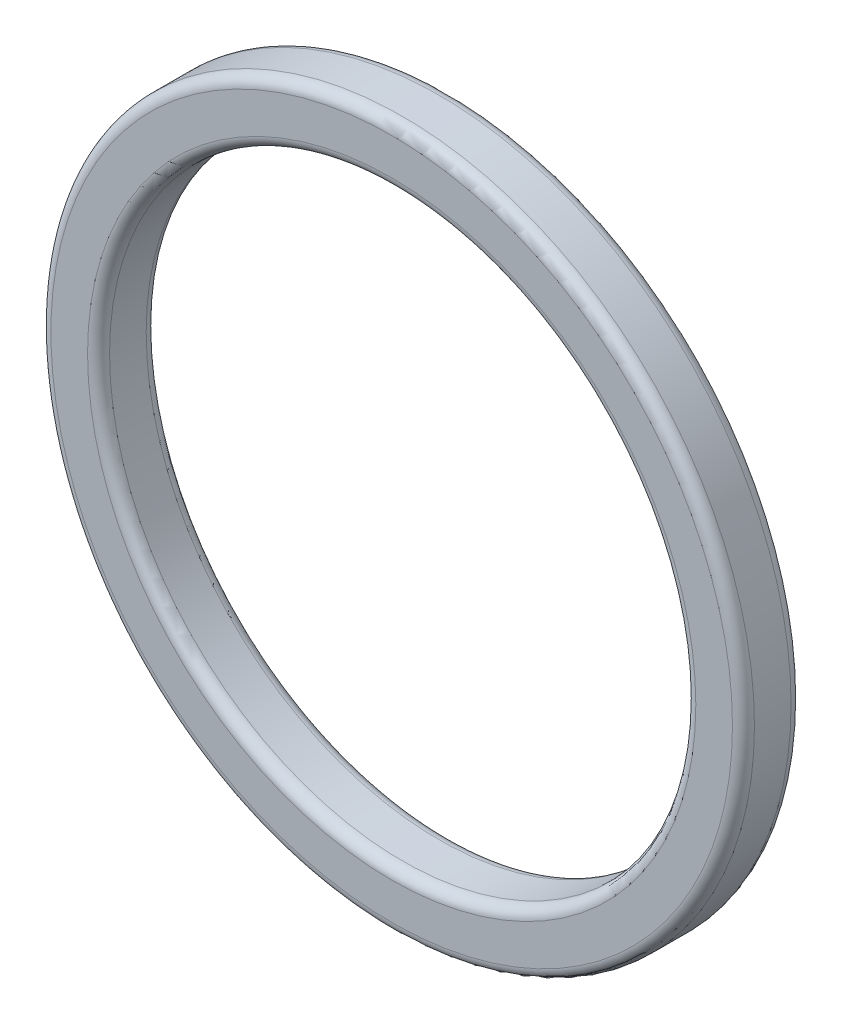
ISO-10303-21;
HEADER;
FILE_DESCRIPTION(('STEP AP214'),'2;1');
FILE_NAME('part.step','',(''),(''),'','','');
FILE_SCHEMA(('AUTOMOTIVE_DESIGN { 1 0 10303 214 1 1 1 1 }'));
ENDSEC;
DATA;
#1=APPLICATION_CONTEXT('core data for automotive mechanical design processes');
#2=APPLICATION_PROTOCOL_DEFINITION('international standard','automotive_design',2000,#1);
#3=PRODUCT_CONTEXT('',#1,'mechanical');
#4=PRODUCT('Part','Part','',(#3));
#5=PRODUCT_RELATED_PRODUCT_CATEGORY('part','',(#4));
#6=PRODUCT_DEFINITION_FORMATION('','',#4);
#7=PRODUCT_DEFINITION_CONTEXT('part definition',#1,'design');
#8=PRODUCT_DEFINITION('design','',#6,#7);
#9=PRODUCT_DEFINITION_SHAPE('','',#8);
#10=(LENGTH_UNIT() NAMED_UNIT(*) SI_UNIT(.MILLI.,.METRE.));
#11=(NAMED_UNIT(*) PLANE_ANGLE_UNIT() SI_UNIT($,.RADIAN.));
#12=(NAMED_UNIT(*) SI_UNIT($,.STERADIAN.) SOLID_ANGLE_UNIT());
#13=UNCERTAINTY_MEASURE_WITH_UNIT(LENGTH_MEASURE(1.E-05),#10,'distance_accuracy_value','');
#14=(GEOMETRIC_REPRESENTATION_CONTEXT(3) GLOBAL_UNCERTAINTY_ASSIGNED_CONTEXT((#13)) GLOBAL_UNIT_ASSIGNED_CONTEXT((#10,
#11,#12)) REPRESENTATION_CONTEXT('',''));
#15=CARTESIAN_POINT('',(0.,0.,0.));
#16=DIRECTION('',(0.,0.,1.));
#17=DIRECTION('',(1.,0.,0.));
#18=AXIS2_PLACEMENT_3D('',#15,#16,#17);
#19=CARTESIAN_POINT('',(0.,0.,8.));
#20=DIRECTION('',(0.,0.,-1.));
#21=DIRECTION('',(-1.,0.,0.));
#22=AXIS2_PLACEMENT_3D('',#19,#20,#21);
#23=CYLINDRICAL_SURFACE('',#22,48.);
#24=CARTESIAN_POINT('',(0.,0.,1.5));
#25=DIRECTION('',(0.,0.,1.));
#26=DIRECTION('',(1.,0.,0.));
#27=AXIS2_PLACEMENT_3D('',#24,#25,#26);
#28=CIRCLE('',#27,48.);
#29=CARTESIAN_POINT('',(48.,0.,1.5));
#30=VERTEX_POINT('',#29);
#31=EDGE_CURVE('E10',#30,#30,#28,.T.);
#32=ORIENTED_EDGE('',*,*,#31,.T.);
#33=EDGE_LOOP('',(#32));
#34=FACE_BOUND('',#33,.T.);
#35=CARTESIAN_POINT('',(0.,0.,6.5));
#36=DIRECTION('',(0.,0.,1.));
#37=DIRECTION('',(1.,0.,0.));
#38=AXIS2_PLACEMENT_3D('',#35,#36,#37);
#39=CIRCLE('',#38,48.);
#40=CARTESIAN_POINT('',(48.,0.,6.5));
#41=VERTEX_POINT('',#40);
#42=EDGE_CURVE('E44',#41,#41,#39,.F.);
#43=ORIENTED_EDGE('',*,*,#42,.T.);
#44=EDGE_LOOP('',(#43));
#45=FACE_BOUND('',#44,.T.);
#46=ADVANCED_FACE('F37',(#34,#45),#23,.T.);
#47=CARTESIAN_POINT('',(0.,0.,8.));
#48=DIRECTION('',(0.,0.,1.));
#49=DIRECTION('',(1.,0.,0.));
#50=AXIS2_PLACEMENT_3D('',#47,#48,#49);
#51=PLANE('',#50);
#52=CARTESIAN_POINT('',(0.,0.,8.));
#53=DIRECTION('',(0.,0.,1.));
#54=DIRECTION('',(1.,0.,0.));
#55=AXIS2_PLACEMENT_3D('',#52,#53,#54);
#56=CIRCLE('',#55,41.5);
#57=CARTESIAN_POINT('',(41.5,0.,8.));
#58=VERTEX_POINT('',#57);
#59=EDGE_CURVE('E57',#58,#58,#56,.F.);
#60=ORIENTED_EDGE('',*,*,#59,.T.);
#61=EDGE_LOOP('',(#60));
#62=FACE_BOUND('',#61,.T.);
#63=CARTESIAN_POINT('',(0.,0.,8.));
#64=DIRECTION('',(0.,0.,1.));
#65=DIRECTION('',(1.,0.,0.));
#66=AXIS2_PLACEMENT_3D('',#63,#64,#65);
#67=CIRCLE('',#66,46.5);
#68=CARTESIAN_POINT('',(46.5,0.,8.));
#69=VERTEX_POINT('',#68);
#70=EDGE_CURVE('E60',#69,#69,#67,.T.);
#71=ORIENTED_EDGE('',*,*,#70,.T.);
#72=EDGE_LOOP('',(#71));
#73=FACE_BOUND('',#72,.T.);
#74=ADVANCED_FACE('F83',(#62,#73),#51,.T.);
#75=CARTESIAN_POINT('',(0.,0.,0.));
#76=DIRECTION('',(0.,0.,1.));
#77=DIRECTION('',(1.,0.,0.));
#78=AXIS2_PLACEMENT_3D('',#75,#76,#77);
#79=PLANE('',#78);
#80=CARTESIAN_POINT('',(0.,0.,0.));
#81=DIRECTION('',(0.,0.,1.));
#82=DIRECTION('',(1.,0.,0.));
#83=AXIS2_PLACEMENT_3D('',#80,#81,#82);
#84=CIRCLE('',#83,41.5);
#85=CARTESIAN_POINT('',(41.5,0.,0.));
#86=VERTEX_POINT('',#85);
#87=EDGE_CURVE('E48',#86,#86,#84,.T.);
#88=ORIENTED_EDGE('',*,*,#87,.T.);
#89=EDGE_LOOP('',(#88));
#90=FACE_BOUND('',#89,.T.);
#91=CARTESIAN_POINT('',(0.,0.,0.));
#92=DIRECTION('',(0.,0.,1.));
#93=DIRECTION('',(1.,0.,0.));
#94=AXIS2_PLACEMENT_3D('',#91,#92,#93);
#95=CIRCLE('',#94,46.5);
#96=CARTESIAN_POINT('',(46.5,0.,0.));
#97=VERTEX_POINT('',#96);
#98=EDGE_CURVE('E52',#97,#97,#95,.F.);
#99=ORIENTED_EDGE('',*,*,#98,.T.);
#100=EDGE_LOOP('',(#99));
#101=FACE_BOUND('',#100,.T.);
#102=ADVANCED_FACE('F80',(#90,#101),#79,.F.);
#103=CARTESIAN_POINT('',(0.,0.,0.));
#104=DIRECTION('',(0.,0.,1.));
#105=DIRECTION('',(1.,0.,0.));
#106=AXIS2_PLACEMENT_3D('',#103,#104,#105);
#107=CYLINDRICAL_SURFACE('',#106,40.);
#108=CARTESIAN_POINT('',(0.,0.,6.5));
#109=DIRECTION('',(0.,0.,1.));
#110=DIRECTION('',(1.,0.,0.));
#111=AXIS2_PLACEMENT_3D('',#108,#109,#110);
#112=CIRCLE('',#111,40.);
#113=CARTESIAN_POINT('',(40.,0.,6.5));
#114=VERTEX_POINT('',#113);
#115=EDGE_CURVE('E63',#114,#114,#112,.T.);
#116=ORIENTED_EDGE('',*,*,#115,.T.);
#117=EDGE_LOOP('',(#116));
#118=FACE_BOUND('',#117,.T.);
#119=CARTESIAN_POINT('',(0.,0.,1.5));
#120=DIRECTION('',(0.,0.,1.));
#121=DIRECTION('',(1.,0.,0.));
#122=AXIS2_PLACEMENT_3D('',#119,#120,#121);
#123=CIRCLE('',#122,40.);
#124=CARTESIAN_POINT('',(40.,0.,1.5));
#125=VERTEX_POINT('',#124);
#126=EDGE_CURVE('E66',#125,#125,#123,.F.);
#127=ORIENTED_EDGE('',*,*,#126,.T.);
#128=EDGE_LOOP('',(#127));
#129=FACE_BOUND('',#128,.T.);
#130=ADVANCED_FACE('F70',(#118,#129),#107,.F.);
#131=CARTESIAN_POINT('',(0.,0.,6.5));
#132=DIRECTION('',(0.,0.,1.));
#133=DIRECTION('',(1.,0.,0.));
#134=AXIS2_PLACEMENT_3D('',#131,#132,#133);
#135=TOROIDAL_SURFACE('',#134,41.5,1.5);
#136=ORIENTED_EDGE('',*,*,#59,.F.);
#137=EDGE_LOOP('',(#136));
#138=FACE_BOUND('',#137,.T.);
#139=ORIENTED_EDGE('',*,*,#115,.F.);
#140=EDGE_LOOP('',(#139));
#141=FACE_BOUND('',#140,.T.);
#142=ADVANCED_FACE('F76',(#138,#141),#135,.T.);
#143=CARTESIAN_POINT('',(0.,0.,1.5));
#144=DIRECTION('',(0.,0.,1.));
#145=DIRECTION('',(1.,0.,0.));
#146=AXIS2_PLACEMENT_3D('',#143,#144,#145);
#147=TOROIDAL_SURFACE('',#146,41.5,1.5);
#148=ORIENTED_EDGE('',*,*,#126,.F.);
#149=EDGE_LOOP('',(#148));
#150=FACE_BOUND('',#149,.T.);
#151=ORIENTED_EDGE('',*,*,#87,.F.);
#152=EDGE_LOOP('',(#151));
#153=FACE_BOUND('',#152,.T.);
#154=ADVANCED_FACE('F72',(#150,#153),#147,.T.);
#155=CARTESIAN_POINT('',(0.,0.,1.5));
#156=DIRECTION('',(0.,0.,1.));
#157=DIRECTION('',(1.,0.,0.));
#158=AXIS2_PLACEMENT_3D('',#155,#156,#157);
#159=TOROIDAL_SURFACE('',#158,46.5,1.5);
#160=ORIENTED_EDGE('',*,*,#98,.F.);
#161=EDGE_LOOP('',(#160));
#162=FACE_BOUND('',#161,.T.);
#163=ORIENTED_EDGE('',*,*,#31,.F.);
#164=EDGE_LOOP('',(#163));
#165=FACE_BOUND('',#164,.T.);
#166=ADVANCED_FACE('F75',(#162,#165),#159,.T.);
#167=CARTESIAN_POINT('',(0.,0.,6.5));
#168=DIRECTION('',(0.,0.,1.));
#169=DIRECTION('',(1.,0.,0.));
#170=AXIS2_PLACEMENT_3D('',#167,#168,#169);
#171=TOROIDAL_SURFACE('',#170,46.5,1.5);
#172=ORIENTED_EDGE('',*,*,#42,.F.);
#173=EDGE_LOOP('',(#172));
#174=FACE_BOUND('',#173,.T.);
#175=ORIENTED_EDGE('',*,*,#70,.F.);
#176=EDGE_LOOP('',(#175));
#177=FACE_BOUND('',#176,.T.);
#178=ADVANCED_FACE('F39',(#174,#177),#171,.T.);
#179=CLOSED_SHELL('',(#46,#74,#102,#130,#142,#154,#166,#178));
#180=MANIFOLD_SOLID_BREP('B2',#179);
#181=ADVANCED_BREP_SHAPE_REPRESENTATION('',(#18,#180),#14);
#182=SHAPE_DEFINITION_REPRESENTATION(#9,#181);
ENDSEC;
END-ISO-10303-21;
